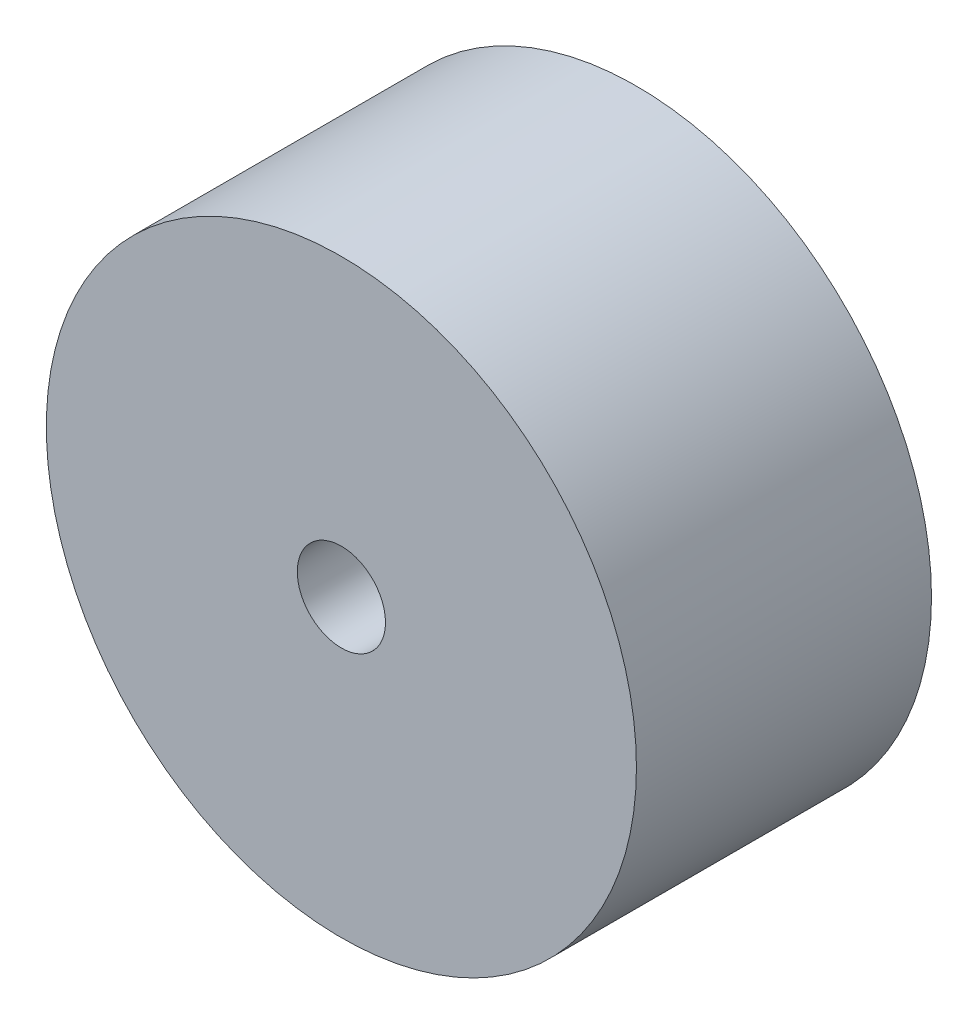
ISO-10303-21;
HEADER;
FILE_DESCRIPTION(('STEP AP214'),'2;1');
FILE_NAME('part.step','',(''),(''),'','','');
FILE_SCHEMA(('AUTOMOTIVE_DESIGN { 1 0 10303 214 1 1 1 1 }'));
ENDSEC;
DATA;
#1=APPLICATION_CONTEXT('core data for automotive mechanical design processes');
#2=APPLICATION_PROTOCOL_DEFINITION('international standard','automotive_design',2000,#1);
#3=PRODUCT_CONTEXT('',#1,'mechanical');
#4=PRODUCT('Part','Part','',(#3));
#5=PRODUCT_RELATED_PRODUCT_CATEGORY('part','',(#4));
#6=PRODUCT_DEFINITION_FORMATION('','',#4);
#7=PRODUCT_DEFINITION_CONTEXT('part definition',#1,'design');
#8=PRODUCT_DEFINITION('design','',#6,#7);
#9=PRODUCT_DEFINITION_SHAPE('','',#8);
#10=(LENGTH_UNIT() NAMED_UNIT(*) SI_UNIT(.MILLI.,.METRE.));
#11=(NAMED_UNIT(*) PLANE_ANGLE_UNIT() SI_UNIT($,.RADIAN.));
#12=(NAMED_UNIT(*) SI_UNIT($,.STERADIAN.) SOLID_ANGLE_UNIT());
#13=UNCERTAINTY_MEASURE_WITH_UNIT(LENGTH_MEASURE(1.E-05),#10,'distance_accuracy_value','');
#14=(GEOMETRIC_REPRESENTATION_CONTEXT(3) GLOBAL_UNCERTAINTY_ASSIGNED_CONTEXT((#13)) GLOBAL_UNIT_ASSIGNED_CONTEXT((#10,
#11,#12)) REPRESENTATION_CONTEXT('',''));
#15=CARTESIAN_POINT('',(0.,0.,0.));
#16=DIRECTION('',(0.,0.,1.));
#17=DIRECTION('',(1.,0.,0.));
#18=AXIS2_PLACEMENT_3D('',#15,#16,#17);
#19=CARTESIAN_POINT('',(0.,0.,12.7));
#20=DIRECTION('',(0.,0.,-1.));
#21=DIRECTION('',(-1.,0.,0.));
#22=AXIS2_PLACEMENT_3D('',#19,#20,#21);
#23=CYLINDRICAL_SURFACE('',#22,12.7);
#24=CARTESIAN_POINT('',(0.,0.,12.7));
#25=DIRECTION('',(0.,0.,1.));
#26=DIRECTION('',(1.,0.,0.));
#27=AXIS2_PLACEMENT_3D('',#24,#25,#26);
#28=CIRCLE('',#27,12.7);
#29=CARTESIAN_POINT('',(12.7,0.,12.7));
#30=VERTEX_POINT('',#29);
#31=EDGE_CURVE('E10',#30,#30,#28,.T.);
#32=ORIENTED_EDGE('',*,*,#31,.F.);
#33=EDGE_LOOP('',(#32));
#34=FACE_BOUND('',#33,.T.);
#35=CARTESIAN_POINT('',(0.,0.,0.));
#36=DIRECTION('',(0.,0.,1.));
#37=DIRECTION('',(1.,0.,0.));
#38=AXIS2_PLACEMENT_3D('',#35,#36,#37);
#39=CIRCLE('',#38,12.7);
#40=CARTESIAN_POINT('',(12.7,0.,0.));
#41=VERTEX_POINT('',#40);
#42=EDGE_CURVE('E40',#41,#41,#39,.T.);
#43=ORIENTED_EDGE('',*,*,#42,.T.);
#44=EDGE_LOOP('',(#43));
#45=FACE_BOUND('',#44,.T.);
#46=ADVANCED_FACE('F37',(#34,#45),#23,.T.);
#47=CARTESIAN_POINT('',(0.,0.,12.7));
#48=DIRECTION('',(0.,0.,1.));
#49=DIRECTION('',(1.,0.,0.));
#50=AXIS2_PLACEMENT_3D('',#47,#48,#49);
#51=PLANE('',#50);
#52=CARTESIAN_POINT('',(0.,0.,12.7));
#53=DIRECTION('',(0.,0.,1.));
#54=DIRECTION('',(1.,0.,0.));
#55=AXIS2_PLACEMENT_3D('',#52,#53,#54);
#56=CIRCLE('',#55,1.89865);
#57=CARTESIAN_POINT('',(1.89865,0.,12.7));
#58=VERTEX_POINT('',#57);
#59=EDGE_CURVE('E54',#58,#58,#56,.T.);
#60=ORIENTED_EDGE('',*,*,#59,.F.);
#61=EDGE_LOOP('',(#60));
#62=FACE_BOUND('',#61,.T.);
#63=ORIENTED_EDGE('',*,*,#31,.T.);
#64=EDGE_LOOP('',(#63));
#65=FACE_BOUND('',#64,.T.);
#66=ADVANCED_FACE('F61',(#62,#65),#51,.T.);
#67=CARTESIAN_POINT('',(0.,0.,0.));
#68=DIRECTION('',(0.,0.,1.));
#69=DIRECTION('',(1.,0.,0.));
#70=AXIS2_PLACEMENT_3D('',#67,#68,#69);
#71=PLANE('',#70);
#72=CARTESIAN_POINT('',(0.,0.,0.));
#73=DIRECTION('',(0.,0.,1.));
#74=DIRECTION('',(1.,0.,0.));
#75=AXIS2_PLACEMENT_3D('',#72,#73,#74);
#76=CIRCLE('',#75,1.89865);
#77=CARTESIAN_POINT('',(1.89865,0.,0.));
#78=VERTEX_POINT('',#77);
#79=EDGE_CURVE('E49',#78,#78,#76,.T.);
#80=ORIENTED_EDGE('',*,*,#79,.T.);
#81=EDGE_LOOP('',(#80));
#82=FACE_BOUND('',#81,.T.);
#83=ORIENTED_EDGE('',*,*,#42,.F.);
#84=EDGE_LOOP('',(#83));
#85=FACE_BOUND('',#84,.T.);
#86=ADVANCED_FACE('F63',(#82,#85),#71,.F.);
#87=CARTESIAN_POINT('',(0.,0.,12.7));
#88=DIRECTION('',(0.,0.,1.));
#89=DIRECTION('',(1.,0.,0.));
#90=AXIS2_PLACEMENT_3D('',#87,#88,#89);
#91=CYLINDRICAL_SURFACE('',#90,1.89865);
#92=ORIENTED_EDGE('',*,*,#79,.F.);
#93=EDGE_LOOP('',(#92));
#94=FACE_BOUND('',#93,.T.);
#95=ORIENTED_EDGE('',*,*,#59,.T.);
#96=EDGE_LOOP('',(#95));
#97=FACE_BOUND('',#96,.T.);
#98=ADVANCED_FACE('F59',(#94,#97),#91,.F.);
#99=CLOSED_SHELL('',(#46,#66,#86,#98));
#100=MANIFOLD_SOLID_BREP('B2',#99);
#101=ADVANCED_BREP_SHAPE_REPRESENTATION('',(#18,#100),#14);
#102=SHAPE_DEFINITION_REPRESENTATION(#9,#101);
ENDSEC;
END-ISO-10303-21;
